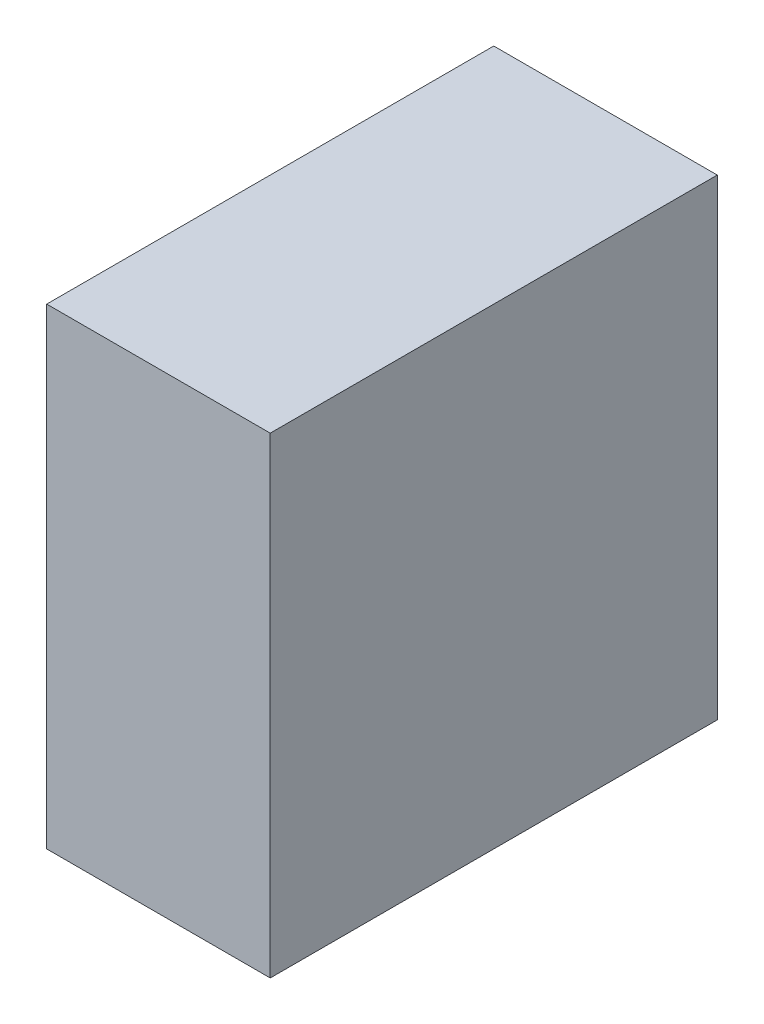
ISO-10303-21;
HEADER;
FILE_DESCRIPTION(('STEP AP214'),'2;1');
FILE_NAME('part.step','',(''),(''),'','','');
FILE_SCHEMA(('AUTOMOTIVE_DESIGN { 1 0 10303 214 1 1 1 1 }'));
ENDSEC;
DATA;
#1=APPLICATION_CONTEXT('core data for automotive mechanical design processes');
#2=APPLICATION_PROTOCOL_DEFINITION('international standard','automotive_design',2000,#1);
#3=PRODUCT_CONTEXT('',#1,'mechanical');
#4=PRODUCT('Part','Part','',(#3));
#5=PRODUCT_RELATED_PRODUCT_CATEGORY('part','',(#4));
#6=PRODUCT_DEFINITION_FORMATION('','',#4);
#7=PRODUCT_DEFINITION_CONTEXT('part definition',#1,'design');
#8=PRODUCT_DEFINITION('design','',#6,#7);
#9=PRODUCT_DEFINITION_SHAPE('','',#8);
#10=(LENGTH_UNIT() NAMED_UNIT(*) SI_UNIT(.MILLI.,.METRE.));
#11=(NAMED_UNIT(*) PLANE_ANGLE_UNIT() SI_UNIT($,.RADIAN.));
#12=(NAMED_UNIT(*) SI_UNIT($,.STERADIAN.) SOLID_ANGLE_UNIT());
#13=UNCERTAINTY_MEASURE_WITH_UNIT(LENGTH_MEASURE(1.E-05),#10,'distance_accuracy_value','');
#14=(GEOMETRIC_REPRESENTATION_CONTEXT(3) GLOBAL_UNCERTAINTY_ASSIGNED_CONTEXT((#13)) GLOBAL_UNIT_ASSIGNED_CONTEXT((#10,
#11,#12)) REPRESENTATION_CONTEXT('',''));
#15=CARTESIAN_POINT('',(0.,0.,0.));
#16=DIRECTION('',(0.,0.,1.));
#17=DIRECTION('',(1.,0.,0.));
#18=AXIS2_PLACEMENT_3D('',#15,#16,#17);
#19=CARTESIAN_POINT('',(-28.575,120.65,57.15));
#20=DIRECTION('',(1.,0.,0.));
#21=DIRECTION('',(0.,1.,0.));
#22=AXIS2_PLACEMENT_3D('',#19,#20,#21);
#23=PLANE('',#22);
#24=DIRECTION('',(0.,-1.,0.));
#25=VECTOR('',#24,1.);
#26=CARTESIAN_POINT('',(-28.575,120.65,-57.15));
#27=LINE('',#26,#25);
#28=CARTESIAN_POINT('',(-28.575,120.65,-57.15));
#29=VERTEX_POINT('',#28);
#30=CARTESIAN_POINT('',(-28.575,0.,-57.15));
#31=VERTEX_POINT('',#30);
#32=EDGE_CURVE('E95',#29,#31,#27,.T.);
#33=ORIENTED_EDGE('',*,*,#32,.T.);
#34=DIRECTION('',(0.,0.,-1.));
#35=VECTOR('',#34,1.);
#36=CARTESIAN_POINT('',(-28.575,0.,57.15));
#37=LINE('',#36,#35);
#38=CARTESIAN_POINT('',(-28.575,0.,57.15));
#39=VERTEX_POINT('',#38);
#40=EDGE_CURVE('E11',#39,#31,#37,.T.);
#41=ORIENTED_EDGE('',*,*,#40,.F.);
#42=DIRECTION('',(0.,-1.,0.));
#43=VECTOR('',#42,1.);
#44=CARTESIAN_POINT('',(-28.575,120.65,57.15));
#45=LINE('',#44,#43);
#46=CARTESIAN_POINT('',(-28.575,120.65,57.15));
#47=VERTEX_POINT('',#46);
#48=EDGE_CURVE('E83',#47,#39,#45,.T.);
#49=ORIENTED_EDGE('',*,*,#48,.F.);
#50=DIRECTION('',(0.,0.,-1.));
#51=VECTOR('',#50,1.);
#52=CARTESIAN_POINT('',(-28.575,120.65,57.15));
#53=LINE('',#52,#51);
#54=EDGE_CURVE('E91',#47,#29,#53,.T.);
#55=ORIENTED_EDGE('',*,*,#54,.T.);
#56=EDGE_LOOP('',(#33,#41,#49,#55));
#57=FACE_BOUND('',#56,.T.);
#58=ADVANCED_FACE('F32',(#57),#23,.F.);
#59=CARTESIAN_POINT('',(-28.575,0.,57.15));
#60=DIRECTION('',(0.,1.,0.));
#61=DIRECTION('',(0.,0.,1.));
#62=AXIS2_PLACEMENT_3D('',#59,#60,#61);
#63=PLANE('',#62);
#64=DIRECTION('',(1.,0.,0.));
#65=VECTOR('',#64,1.);
#66=CARTESIAN_POINT('',(-28.575,0.,-57.15));
#67=LINE('',#66,#65);
#68=CARTESIAN_POINT('',(28.575,0.,-57.15));
#69=VERTEX_POINT('',#68);
#70=EDGE_CURVE('E87',#31,#69,#67,.T.);
#71=ORIENTED_EDGE('',*,*,#70,.T.);
#72=DIRECTION('',(0.,0.,-1.));
#73=VECTOR('',#72,1.);
#74=CARTESIAN_POINT('',(28.575,0.,57.15));
#75=LINE('',#74,#73);
#76=CARTESIAN_POINT('',(28.575,0.,57.15));
#77=VERTEX_POINT('',#76);
#78=EDGE_CURVE('E40',#77,#69,#75,.T.);
#79=ORIENTED_EDGE('',*,*,#78,.F.);
#80=DIRECTION('',(1.,0.,0.));
#81=VECTOR('',#80,1.);
#82=CARTESIAN_POINT('',(-28.575,0.,57.15));
#83=LINE('',#82,#81);
#84=EDGE_CURVE('E78',#39,#77,#83,.T.);
#85=ORIENTED_EDGE('',*,*,#84,.F.);
#86=ORIENTED_EDGE('',*,*,#40,.T.);
#87=EDGE_LOOP('',(#71,#79,#85,#86));
#88=FACE_BOUND('',#87,.T.);
#89=ADVANCED_FACE('F86',(#88),#63,.F.);
#90=CARTESIAN_POINT('',(28.575,120.65,57.15));
#91=DIRECTION('',(-1.,0.,0.));
#92=DIRECTION('',(0.,-1.,0.));
#93=AXIS2_PLACEMENT_3D('',#90,#91,#92);
#94=PLANE('',#93);
#95=DIRECTION('',(0.,1.,0.));
#96=VECTOR('',#95,1.);
#97=CARTESIAN_POINT('',(28.575,120.65,-57.15));
#98=LINE('',#97,#96);
#99=CARTESIAN_POINT('',(28.575,120.65,-57.15));
#100=VERTEX_POINT('',#99);
#101=EDGE_CURVE('E65',#69,#100,#98,.T.);
#102=ORIENTED_EDGE('',*,*,#101,.T.);
#103=DIRECTION('',(0.,0.,-1.));
#104=VECTOR('',#103,1.);
#105=CARTESIAN_POINT('',(28.575,120.65,57.15));
#106=LINE('',#105,#104);
#107=CARTESIAN_POINT('',(28.575,120.65,57.15));
#108=VERTEX_POINT('',#107);
#109=EDGE_CURVE('E88',#108,#100,#106,.T.);
#110=ORIENTED_EDGE('',*,*,#109,.F.);
#111=DIRECTION('',(0.,1.,0.));
#112=VECTOR('',#111,1.);
#113=CARTESIAN_POINT('',(28.575,120.65,57.15));
#114=LINE('',#113,#112);
#115=EDGE_CURVE('E81',#77,#108,#114,.T.);
#116=ORIENTED_EDGE('',*,*,#115,.F.);
#117=ORIENTED_EDGE('',*,*,#78,.T.);
#118=EDGE_LOOP('',(#102,#110,#116,#117));
#119=FACE_BOUND('',#118,.T.);
#120=ADVANCED_FACE('F89',(#119),#94,.F.);
#121=CARTESIAN_POINT('',(-28.575,120.65,57.15));
#122=DIRECTION('',(0.,-1.,0.));
#123=DIRECTION('',(0.,0.,-1.));
#124=AXIS2_PLACEMENT_3D('',#121,#122,#123);
#125=PLANE('',#124);
#126=DIRECTION('',(-1.,0.,0.));
#127=VECTOR('',#126,1.);
#128=CARTESIAN_POINT('',(-28.575,120.65,-57.15));
#129=LINE('',#128,#127);
#130=EDGE_CURVE('E71',#100,#29,#129,.T.);
#131=ORIENTED_EDGE('',*,*,#130,.T.);
#132=ORIENTED_EDGE('',*,*,#54,.F.);
#133=DIRECTION('',(-1.,0.,0.));
#134=VECTOR('',#133,1.);
#135=CARTESIAN_POINT('',(-28.575,120.65,57.15));
#136=LINE('',#135,#134);
#137=EDGE_CURVE('E48',#108,#47,#136,.T.);
#138=ORIENTED_EDGE('',*,*,#137,.F.);
#139=ORIENTED_EDGE('',*,*,#109,.T.);
#140=EDGE_LOOP('',(#131,#132,#138,#139));
#141=FACE_BOUND('',#140,.T.);
#142=ADVANCED_FACE('F102',(#141),#125,.F.);
#143=CARTESIAN_POINT('',(0.,0.,57.15));
#144=DIRECTION('',(0.,0.,1.));
#145=DIRECTION('',(1.,0.,0.));
#146=AXIS2_PLACEMENT_3D('',#143,#144,#145);
#147=PLANE('',#146);
#148=ORIENTED_EDGE('',*,*,#48,.T.);
#149=ORIENTED_EDGE('',*,*,#84,.T.);
#150=ORIENTED_EDGE('',*,*,#115,.T.);
#151=ORIENTED_EDGE('',*,*,#137,.T.);
#152=EDGE_LOOP('',(#148,#149,#150,#151));
#153=FACE_BOUND('',#152,.T.);
#154=ADVANCED_FACE('F79',(#153),#147,.T.);
#155=CARTESIAN_POINT('',(0.,0.,-57.15));
#156=DIRECTION('',(0.,0.,1.));
#157=DIRECTION('',(1.,0.,0.));
#158=AXIS2_PLACEMENT_3D('',#155,#156,#157);
#159=PLANE('',#158);
#160=ORIENTED_EDGE('',*,*,#32,.F.);
#161=ORIENTED_EDGE('',*,*,#130,.F.);
#162=ORIENTED_EDGE('',*,*,#101,.F.);
#163=ORIENTED_EDGE('',*,*,#70,.F.);
#164=EDGE_LOOP('',(#160,#161,#162,#163));
#165=FACE_BOUND('',#164,.T.);
#166=ADVANCED_FACE('F105',(#165),#159,.F.);
#167=CLOSED_SHELL('',(#58,#89,#120,#142,#154,#166));
#168=MANIFOLD_SOLID_BREP('B2',#167);
#169=ADVANCED_BREP_SHAPE_REPRESENTATION('',(#18,#168),#14);
#170=SHAPE_DEFINITION_REPRESENTATION(#9,#169);
ENDSEC;
END-ISO-10303-21;
